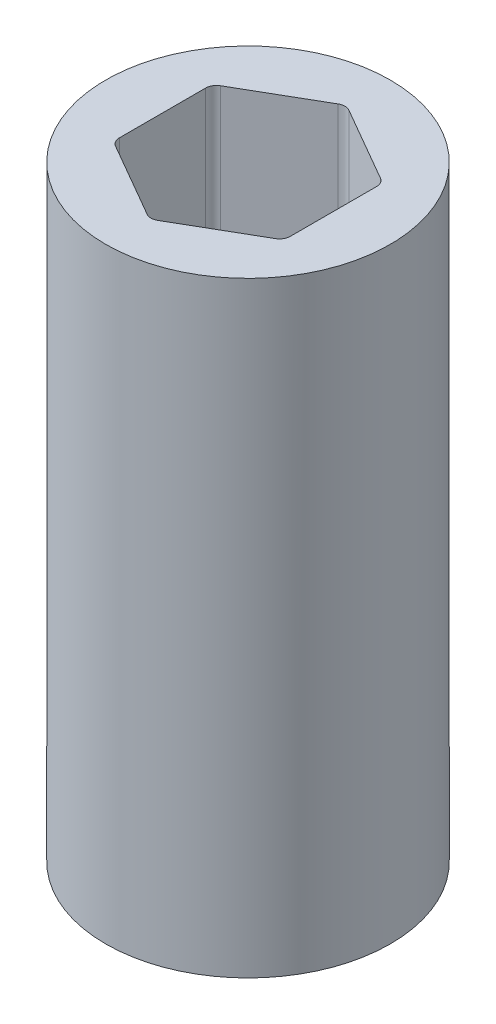
ISO-10303-21;
HEADER;
FILE_DESCRIPTION(('STEP AP214'),'2;1');
FILE_NAME('part.step','',(''),(''),'','','');
FILE_SCHEMA(('AUTOMOTIVE_DESIGN { 1 0 10303 214 1 1 1 1 }'));
ENDSEC;
DATA;
#1=APPLICATION_CONTEXT('core data for automotive mechanical design processes');
#2=APPLICATION_PROTOCOL_DEFINITION('international standard','automotive_design',2000,#1);
#3=PRODUCT_CONTEXT('',#1,'mechanical');
#4=PRODUCT('Part','Part','',(#3));
#5=PRODUCT_RELATED_PRODUCT_CATEGORY('part','',(#4));
#6=PRODUCT_DEFINITION_FORMATION('','',#4);
#7=PRODUCT_DEFINITION_CONTEXT('part definition',#1,'design');
#8=PRODUCT_DEFINITION('design','',#6,#7);
#9=PRODUCT_DEFINITION_SHAPE('','',#8);
#10=(LENGTH_UNIT() NAMED_UNIT(*) SI_UNIT(.MILLI.,.METRE.));
#11=(NAMED_UNIT(*) PLANE_ANGLE_UNIT() SI_UNIT($,.RADIAN.));
#12=(NAMED_UNIT(*) SI_UNIT($,.STERADIAN.) SOLID_ANGLE_UNIT());
#13=UNCERTAINTY_MEASURE_WITH_UNIT(LENGTH_MEASURE(1.E-05),#10,'distance_accuracy_value','');
#14=(GEOMETRIC_REPRESENTATION_CONTEXT(3) GLOBAL_UNCERTAINTY_ASSIGNED_CONTEXT((#13)) GLOBAL_UNIT_ASSIGNED_CONTEXT((#10,
#11,#12)) REPRESENTATION_CONTEXT('',''));
#15=CARTESIAN_POINT('',(0.,0.,0.));
#16=DIRECTION('',(0.,0.,1.));
#17=DIRECTION('',(1.,0.,0.));
#18=AXIS2_PLACEMENT_3D('',#15,#16,#17);
#19=CARTESIAN_POINT('',(0.,386.241430282593,0.));
#20=DIRECTION('',(0.,1.,0.));
#21=DIRECTION('',(0.,0.,-1.));
#22=AXIS2_PLACEMENT_3D('',#19,#20,#21);
#23=PLANE('',#22);
#24=DIRECTION('',(-0.866025403784439,0.,0.5));
#25=VECTOR('',#24,1.);
#26=CARTESIAN_POINT('',(0.,386.241430282593,-13.856406460551));
#27=LINE('',#26,#25);
#28=CARTESIAN_POINT('',(-0.75,386.241430282593,-13.4233937586588));
#29=VERTEX_POINT('',#28);
#30=CARTESIAN_POINT('',(-11.25,386.241430282593,-7.36121593216776));
#31=VERTEX_POINT('',#30);
#32=EDGE_CURVE('E271',#29,#31,#27,.T.);
#33=ORIENTED_EDGE('',*,*,#32,.T.);
#34=CARTESIAN_POINT('',(-10.5,386.241430282593,-6.0621778264911));
#35=DIRECTION('',(0.,1.,0.));
#36=DIRECTION('',(0.,0.,1.));
#37=AXIS2_PLACEMENT_3D('',#34,#35,#36);
#38=CIRCLE('',#37,1.5);
#39=CARTESIAN_POINT('',(-12.,386.241430282593,-6.0621778264911));
#40=VERTEX_POINT('',#39);
#41=EDGE_CURVE('E214',#31,#40,#38,.T.);
#42=ORIENTED_EDGE('',*,*,#41,.T.);
#43=DIRECTION('',(0.,0.,1.));
#44=VECTOR('',#43,1.);
#45=CARTESIAN_POINT('',(-12.,386.241430282593,-6.92820323027554));
#46=LINE('',#45,#44);
#47=CARTESIAN_POINT('',(-12.,386.241430282593,6.06217782649105));
#48=VERTEX_POINT('',#47);
#49=EDGE_CURVE('E273',#40,#48,#46,.T.);
#50=ORIENTED_EDGE('',*,*,#49,.T.);
#51=CARTESIAN_POINT('',(-10.5,386.241430282593,6.06217782649105));
#52=DIRECTION('',(0.,1.,0.));
#53=DIRECTION('',(0.,0.,1.));
#54=AXIS2_PLACEMENT_3D('',#51,#52,#53);
#55=CIRCLE('',#54,1.5);
#56=CARTESIAN_POINT('',(-11.25,386.241430282593,7.36121593216771));
#57=VERTEX_POINT('',#56);
#58=EDGE_CURVE('E212',#48,#57,#55,.T.);
#59=ORIENTED_EDGE('',*,*,#58,.T.);
#60=DIRECTION('',(0.866025403784439,0.,0.5));
#61=VECTOR('',#60,1.);
#62=CARTESIAN_POINT('',(-12.,386.241430282593,6.92820323027549));
#63=LINE('',#62,#61);
#64=CARTESIAN_POINT('',(-0.750000000000006,386.241430282593,13.4233937586588));
#65=VERTEX_POINT('',#64);
#66=EDGE_CURVE('E279',#57,#65,#63,.T.);
#67=ORIENTED_EDGE('',*,*,#66,.T.);
#68=CARTESIAN_POINT('',(0.,386.241430282593,12.1243556529821));
#69=DIRECTION('',(0.,1.,0.));
#70=DIRECTION('',(0.,0.,1.));
#71=AXIS2_PLACEMENT_3D('',#68,#69,#70);
#72=CIRCLE('',#71,1.5);
#73=CARTESIAN_POINT('',(0.749999999999996,386.241430282593,13.4233937586588));
#74=VERTEX_POINT('',#73);
#75=EDGE_CURVE('E210',#65,#74,#72,.T.);
#76=ORIENTED_EDGE('',*,*,#75,.T.);
#77=DIRECTION('',(0.866025403784439,0.,-0.5));
#78=VECTOR('',#77,1.);
#79=CARTESIAN_POINT('',(0.,386.241430282593,13.856406460551));
#80=LINE('',#79,#78);
#81=CARTESIAN_POINT('',(11.25,386.241430282593,7.36121593216771));
#82=VERTEX_POINT('',#81);
#83=EDGE_CURVE('E282',#74,#82,#80,.T.);
#84=ORIENTED_EDGE('',*,*,#83,.T.);
#85=CARTESIAN_POINT('',(10.5,386.241430282593,6.06217782649105));
#86=DIRECTION('',(0.,1.,0.));
#87=DIRECTION('',(0.,0.,1.));
#88=AXIS2_PLACEMENT_3D('',#85,#86,#87);
#89=CIRCLE('',#88,1.5);
#90=CARTESIAN_POINT('',(12.,386.241430282593,6.06217782649105));
#91=VERTEX_POINT('',#90);
#92=EDGE_CURVE('E208',#82,#91,#89,.T.);
#93=ORIENTED_EDGE('',*,*,#92,.T.);
#94=DIRECTION('',(0.,0.,-1.));
#95=VECTOR('',#94,1.);
#96=CARTESIAN_POINT('',(12.,386.241430282593,6.92820323027549));
#97=LINE('',#96,#95);
#98=CARTESIAN_POINT('',(12.,386.241430282593,5.28750097478772));
#99=VERTEX_POINT('',#98);
#100=EDGE_CURVE('E286',#91,#99,#97,.T.);
#101=ORIENTED_EDGE('',*,*,#100,.T.);
#102=DIRECTION('',(-1.,0.,0.));
#103=VECTOR('',#102,1.);
#104=CARTESIAN_POINT('',(14.8628292452561,386.241430282593,5.28750097478773));
#105=LINE('',#104,#103);
#106=CARTESIAN_POINT('',(10.6328715990376,386.241430282593,5.28750097478773));
#107=VERTEX_POINT('',#106);
#108=EDGE_CURVE('E314',#99,#107,#105,.T.);
#109=ORIENTED_EDGE('',*,*,#108,.T.);
#110=CARTESIAN_POINT('',(0.,386.241430282593,0.));
#111=DIRECTION('',(0.,-1.,0.));
#112=DIRECTION('',(0.934966219225068,0.,-0.354736760017878));
#113=AXIS2_PLACEMENT_3D('',#110,#111,#112);
#114=CIRCLE('',#113,11.875);
#115=CARTESIAN_POINT('',(11.1027238532977,386.241430282593,-4.21249902521229));
#116=VERTEX_POINT('',#115);
#117=EDGE_CURVE('E298',#107,#116,#114,.T.);
#118=ORIENTED_EDGE('',*,*,#117,.T.);
#119=DIRECTION('',(1.,0.,0.));
#120=VECTOR('',#119,1.);
#121=CARTESIAN_POINT('',(11.1027238532977,386.241430282593,-4.21249902521229));
#122=LINE('',#121,#120);
#123=CARTESIAN_POINT('',(12.,386.241430282593,-4.21249902521229));
#124=VERTEX_POINT('',#123);
#125=EDGE_CURVE('E186',#116,#124,#122,.T.);
#126=ORIENTED_EDGE('',*,*,#125,.T.);
#127=CARTESIAN_POINT('',(12.,386.241430282593,-6.0621778264911));
#128=VERTEX_POINT('',#127);
#129=EDGE_CURVE('E192',#124,#128,#97,.T.);
#130=ORIENTED_EDGE('',*,*,#129,.T.);
#131=CARTESIAN_POINT('',(10.5,386.241430282593,-6.0621778264911));
#132=DIRECTION('',(0.,1.,0.));
#133=DIRECTION('',(0.,0.,1.));
#134=AXIS2_PLACEMENT_3D('',#131,#132,#133);
#135=CIRCLE('',#134,1.5);
#136=CARTESIAN_POINT('',(11.25,386.241430282593,-7.36121593216776));
#137=VERTEX_POINT('',#136);
#138=EDGE_CURVE('E206',#128,#137,#135,.T.);
#139=ORIENTED_EDGE('',*,*,#138,.T.);
#140=DIRECTION('',(-0.866025403784439,0.,-0.5));
#141=VECTOR('',#140,1.);
#142=CARTESIAN_POINT('',(12.,386.241430282593,-6.92820323027554));
#143=LINE('',#142,#141);
#144=CARTESIAN_POINT('',(0.750000000000001,386.241430282593,-13.4233937586588));
#145=VERTEX_POINT('',#144);
#146=EDGE_CURVE('E268',#137,#145,#143,.T.);
#147=ORIENTED_EDGE('',*,*,#146,.T.);
#148=CARTESIAN_POINT('',(0.,386.241430282593,-12.1243556529822));
#149=DIRECTION('',(0.,1.,0.));
#150=DIRECTION('',(0.,0.,1.));
#151=AXIS2_PLACEMENT_3D('',#148,#149,#150);
#152=CIRCLE('',#151,1.5);
#153=EDGE_CURVE('E204',#145,#29,#152,.T.);
#154=ORIENTED_EDGE('',*,*,#153,.T.);
#155=EDGE_LOOP('',(#33,#42,#50,#59,#67,#76,#84,#93,#101,#109,#118,#126,#130,#139,#147,#154));
#156=FACE_BOUND('',#155,.T.);
#157=ADVANCED_FACE('F45',(#156),#23,.T.);
#158=CARTESIAN_POINT('',(0.,345.599983215332,0.));
#159=DIRECTION('',(0.,1.,0.));
#160=DIRECTION('',(0.,0.,-1.));
#161=AXIS2_PLACEMENT_3D('',#158,#159,#160);
#162=PLANE('',#161);
#163=DIRECTION('',(1.,0.,0.));
#164=VECTOR('',#163,1.);
#165=CARTESIAN_POINT('',(11.1027238532977,345.599983215332,-4.21249902521229));
#166=LINE('',#165,#164);
#167=CARTESIAN_POINT('',(11.1027238532977,345.599983215332,-4.21249902521229));
#168=VERTEX_POINT('',#167);
#169=CARTESIAN_POINT('',(14.8628292452561,345.599983215332,-4.21249902521229));
#170=VERTEX_POINT('',#169);
#171=EDGE_CURVE('E319',#168,#170,#166,.T.);
#172=ORIENTED_EDGE('',*,*,#171,.F.);
#173=CARTESIAN_POINT('',(0.,345.599983215332,0.));
#174=DIRECTION('',(0.,-1.,0.));
#175=DIRECTION('',(0.934966219225068,0.,-0.354736760017878));
#176=AXIS2_PLACEMENT_3D('',#173,#174,#175);
#177=CIRCLE('',#176,11.875);
#178=CARTESIAN_POINT('',(10.6328715990376,345.599983215332,5.28750097478773));
#179=VERTEX_POINT('',#178);
#180=EDGE_CURVE('E290',#179,#168,#177,.T.);
#181=ORIENTED_EDGE('',*,*,#180,.F.);
#182=DIRECTION('',(-1.,0.,0.));
#183=VECTOR('',#182,1.);
#184=CARTESIAN_POINT('',(14.8628292452561,345.599983215332,5.28750097478773));
#185=LINE('',#184,#183);
#186=CARTESIAN_POINT('',(14.8628292452561,345.599983215332,5.28750097478773));
#187=VERTEX_POINT('',#186);
#188=EDGE_CURVE('E306',#187,#179,#185,.T.);
#189=ORIENTED_EDGE('',*,*,#188,.F.);
#190=DIRECTION('',(0.,0.,1.));
#191=VECTOR('',#190,1.);
#192=CARTESIAN_POINT('',(14.8628292452561,345.599983215332,-4.21249902521229));
#193=LINE('',#192,#191);
#194=EDGE_CURVE('E307',#170,#187,#193,.T.);
#195=ORIENTED_EDGE('',*,*,#194,.F.);
#196=EDGE_LOOP('',(#172,#181,#189,#195));
#197=FACE_BOUND('',#196,.T.);
#198=CARTESIAN_POINT('',(0.,345.599983215332,0.));
#199=DIRECTION('',(0.,1.,0.));
#200=DIRECTION('',(-1.,0.,0.));
#201=AXIS2_PLACEMENT_3D('',#198,#199,#200);
#202=CIRCLE('',#201,20.);
#203=CARTESIAN_POINT('',(20.,345.599983215332,0.));
#204=VERTEX_POINT('',#203);
#205=EDGE_CURVE('E184',#204,#204,#202,.T.);
#206=ORIENTED_EDGE('',*,*,#205,.F.);
#207=EDGE_LOOP('',(#206));
#208=FACE_BOUND('',#207,.T.);
#209=ADVANCED_FACE('F408',(#197,#208),#162,.F.);
#210=CARTESIAN_POINT('',(0.,355.09996632461,0.));
#211=DIRECTION('',(0.,1.,0.));
#212=DIRECTION('',(-1.,0.,0.));
#213=AXIS2_PLACEMENT_3D('',#210,#211,#212);
#214=CYLINDRICAL_SURFACE('',#213,20.);
#215=DIRECTION('',(0.,-1.,0.));
#216=VECTOR('',#215,1.);
#217=CARTESIAN_POINT('',(20.,355.09996632461,0.));
#218=LINE('',#217,#216);
#219=CARTESIAN_POINT('',(20.,386.241430282593,0.));
#220=VERTEX_POINT('',#219);
#221=EDGE_CURVE('E180',#220,#204,#218,.T.);
#222=ORIENTED_EDGE('',*,*,#221,.F.);
#223=ORIENTED_EDGE('',*,*,#221,.T.);
#224=ORIENTED_EDGE('',*,*,#205,.T.);
#225=EDGE_LOOP('',(#222,#223,#224));
#226=FACE_BOUND('',#225,.T.);
#227=CARTESIAN_POINT('',(0.,430.741430282593,0.));
#228=DIRECTION('',(0.,1.,0.));
#229=DIRECTION('',(0.,0.,1.));
#230=AXIS2_PLACEMENT_3D('',#227,#228,#229);
#231=CIRCLE('',#230,20.);
#232=CARTESIAN_POINT('',(0.,430.741430282593,20.));
#233=VERTEX_POINT('',#232);
#234=EDGE_CURVE('E261',#233,#233,#231,.T.);
#235=ORIENTED_EDGE('',*,*,#234,.F.);
#236=EDGE_LOOP('',(#235));
#237=FACE_BOUND('',#236,.T.);
#238=ADVANCED_FACE('F181',(#226,#237),#214,.T.);
#239=CARTESIAN_POINT('',(11.1027238532977,355.09996632461,-4.21249902521229));
#240=DIRECTION('',(0.,0.,1.));
#241=DIRECTION('',(1.,0.,0.));
#242=AXIS2_PLACEMENT_3D('',#239,#240,#241);
#243=PLANE('',#242);
#244=ORIENTED_EDGE('',*,*,#171,.T.);
#245=DIRECTION('',(0.,1.,0.));
#246=VECTOR('',#245,1.);
#247=CARTESIAN_POINT('',(14.8628292452561,355.09996632461,-4.21249902521229));
#248=LINE('',#247,#246);
#249=CARTESIAN_POINT('',(14.8628292452561,386.241430282593,-4.21249902521229));
#250=VERTEX_POINT('',#249);
#251=EDGE_CURVE('E315',#170,#250,#248,.T.);
#252=ORIENTED_EDGE('',*,*,#251,.T.);
#253=EDGE_CURVE('E195',#124,#250,#122,.T.);
#254=ORIENTED_EDGE('',*,*,#253,.F.);
#255=ORIENTED_EDGE('',*,*,#125,.F.);
#256=DIRECTION('',(0.,1.,0.));
#257=VECTOR('',#256,1.);
#258=CARTESIAN_POINT('',(11.1027238532977,355.09996632461,-4.21249902521229));
#259=LINE('',#258,#257);
#260=EDGE_CURVE('E293',#168,#116,#259,.T.);
#261=ORIENTED_EDGE('',*,*,#260,.F.);
#262=EDGE_LOOP('',(#244,#252,#254,#255,#261));
#263=FACE_BOUND('',#262,.T.);
#264=ADVANCED_FACE('F343',(#263),#243,.T.);
#265=CARTESIAN_POINT('',(14.8628292452561,355.09996632461,-4.21249902521229));
#266=DIRECTION('',(-1.,0.,0.));
#267=DIRECTION('',(0.,1.,0.));
#268=AXIS2_PLACEMENT_3D('',#265,#266,#267);
#269=PLANE('',#268);
#270=ORIENTED_EDGE('',*,*,#194,.T.);
#271=DIRECTION('',(0.,1.,0.));
#272=VECTOR('',#271,1.);
#273=CARTESIAN_POINT('',(14.8628292452561,355.09996632461,5.28750097478773));
#274=LINE('',#273,#272);
#275=CARTESIAN_POINT('',(14.8628292452561,386.241430282593,5.28750097478772));
#276=VERTEX_POINT('',#275);
#277=EDGE_CURVE('E311',#187,#276,#274,.T.);
#278=ORIENTED_EDGE('',*,*,#277,.T.);
#279=DIRECTION('',(0.,0.,1.));
#280=VECTOR('',#279,1.);
#281=CARTESIAN_POINT('',(14.8628292452561,386.241430282593,-4.21249902521229));
#282=LINE('',#281,#280);
#283=EDGE_CURVE('E310',#250,#276,#282,.T.);
#284=ORIENTED_EDGE('',*,*,#283,.F.);
#285=ORIENTED_EDGE('',*,*,#251,.F.);
#286=EDGE_LOOP('',(#270,#278,#284,#285));
#287=FACE_BOUND('',#286,.T.);
#288=ADVANCED_FACE('F346',(#287),#269,.T.);
#289=CARTESIAN_POINT('',(14.8628292452561,355.09996632461,5.28750097478773));
#290=DIRECTION('',(0.,0.,-1.));
#291=DIRECTION('',(-1.,0.,0.));
#292=AXIS2_PLACEMENT_3D('',#289,#290,#291);
#293=PLANE('',#292);
#294=ORIENTED_EDGE('',*,*,#188,.T.);
#295=DIRECTION('',(0.,1.,0.));
#296=VECTOR('',#295,1.);
#297=CARTESIAN_POINT('',(10.6328715990376,355.09996632461,5.28750097478773));
#298=LINE('',#297,#296);
#299=EDGE_CURVE('E302',#179,#107,#298,.T.);
#300=ORIENTED_EDGE('',*,*,#299,.T.);
#301=ORIENTED_EDGE('',*,*,#108,.F.);
#302=EDGE_CURVE('E325',#276,#99,#105,.T.);
#303=ORIENTED_EDGE('',*,*,#302,.F.);
#304=ORIENTED_EDGE('',*,*,#277,.F.);
#305=EDGE_LOOP('',(#294,#300,#301,#303,#304));
#306=FACE_BOUND('',#305,.T.);
#307=ADVANCED_FACE('F352',(#306),#293,.T.);
#308=CARTESIAN_POINT('',(0.,355.09996632461,0.));
#309=DIRECTION('',(0.,1.,0.));
#310=DIRECTION('',(-0.99877918581363,0.,-0.0493977528381742));
#311=AXIS2_PLACEMENT_3D('',#308,#309,#310);
#312=CYLINDRICAL_SURFACE('',#311,11.875);
#313=ORIENTED_EDGE('',*,*,#180,.T.);
#314=ORIENTED_EDGE('',*,*,#260,.T.);
#315=ORIENTED_EDGE('',*,*,#117,.F.);
#316=ORIENTED_EDGE('',*,*,#299,.F.);
#317=EDGE_LOOP('',(#313,#314,#315,#316));
#318=FACE_BOUND('',#317,.T.);
#319=ADVANCED_FACE('F441',(#318),#312,.F.);
#320=CARTESIAN_POINT('',(0.,386.241430282593,0.));
#321=DIRECTION('',(0.,1.,0.));
#322=DIRECTION('',(0.,0.,1.));
#323=AXIS2_PLACEMENT_3D('',#320,#321,#322);
#324=PLANE('',#323);
#325=EDGE_CURVE('E285',#99,#124,#97,.T.);
#326=ORIENTED_EDGE('',*,*,#325,.T.);
#327=ORIENTED_EDGE('',*,*,#253,.T.);
#328=ORIENTED_EDGE('',*,*,#283,.T.);
#329=ORIENTED_EDGE('',*,*,#302,.T.);
#330=EDGE_LOOP('',(#326,#327,#328,#329));
#331=FACE_BOUND('',#330,.T.);
#332=ADVANCED_FACE('F340',(#331),#324,.F.);
#333=CARTESIAN_POINT('',(0.,430.741430282593,0.));
#334=DIRECTION('',(0.,1.,0.));
#335=DIRECTION('',(0.,0.,1.));
#336=AXIS2_PLACEMENT_3D('',#333,#334,#335);
#337=PLANE('',#336);
#338=ORIENTED_EDGE('',*,*,#234,.T.);
#339=EDGE_LOOP('',(#338));
#340=FACE_BOUND('',#339,.T.);
#341=DIRECTION('',(-0.866025403784439,0.,0.5));
#342=VECTOR('',#341,1.);
#343=CARTESIAN_POINT('',(0.,430.741430282593,-13.8564064605511));
#344=LINE('',#343,#342);
#345=CARTESIAN_POINT('',(-0.75,430.741430282593,-13.4233937586588));
#346=VERTEX_POINT('',#345);
#347=CARTESIAN_POINT('',(-11.25,430.741430282593,-7.36121593216776));
#348=VERTEX_POINT('',#347);
#349=EDGE_CURVE('E370',#346,#348,#344,.T.);
#350=ORIENTED_EDGE('',*,*,#349,.F.);
#351=CARTESIAN_POINT('',(0.,430.741430282593,-12.1243556529822));
#352=DIRECTION('',(0.,1.,0.));
#353=DIRECTION('',(0.,0.,1.));
#354=AXIS2_PLACEMENT_3D('',#351,#352,#353);
#355=CIRCLE('',#354,1.5);
#356=CARTESIAN_POINT('',(0.750000000000002,430.741430282593,-13.4233937586588));
#357=VERTEX_POINT('',#356);
#358=EDGE_CURVE('E11',#346,#357,#355,.F.);
#359=ORIENTED_EDGE('',*,*,#358,.T.);
#360=DIRECTION('',(-0.866025403784439,0.,-0.5));
#361=VECTOR('',#360,1.);
#362=CARTESIAN_POINT('',(12.,430.741430282593,-6.92820323027554));
#363=LINE('',#362,#361);
#364=CARTESIAN_POINT('',(11.25,430.741430282593,-7.36121593216776));
#365=VERTEX_POINT('',#364);
#366=EDGE_CURVE('E253',#365,#357,#363,.T.);
#367=ORIENTED_EDGE('',*,*,#366,.F.);
#368=CARTESIAN_POINT('',(10.5,430.741430282593,-6.06217782649111));
#369=DIRECTION('',(0.,1.,0.));
#370=DIRECTION('',(0.,0.,1.));
#371=AXIS2_PLACEMENT_3D('',#368,#369,#370);
#372=CIRCLE('',#371,1.5);
#373=CARTESIAN_POINT('',(12.,430.741430282593,-6.06217782649111));
#374=VERTEX_POINT('',#373);
#375=EDGE_CURVE('E53',#365,#374,#372,.F.);
#376=ORIENTED_EDGE('',*,*,#375,.T.);
#377=DIRECTION('',(0.,0.,-1.));
#378=VECTOR('',#377,1.);
#379=CARTESIAN_POINT('',(12.,430.741430282593,6.92820323027549));
#380=LINE('',#379,#378);
#381=CARTESIAN_POINT('',(12.,430.741430282593,6.06217782649105));
#382=VERTEX_POINT('',#381);
#383=EDGE_CURVE('E251',#382,#374,#380,.T.);
#384=ORIENTED_EDGE('',*,*,#383,.F.);
#385=CARTESIAN_POINT('',(10.5,430.741430282593,6.06217782649105));
#386=DIRECTION('',(0.,1.,0.));
#387=DIRECTION('',(0.,0.,1.));
#388=AXIS2_PLACEMENT_3D('',#385,#386,#387);
#389=CIRCLE('',#388,1.5);
#390=CARTESIAN_POINT('',(11.25,430.741430282593,7.36121593216771));
#391=VERTEX_POINT('',#390);
#392=EDGE_CURVE('E246',#382,#391,#389,.F.);
#393=ORIENTED_EDGE('',*,*,#392,.T.);
#394=DIRECTION('',(0.866025403784439,0.,-0.5));
#395=VECTOR('',#394,1.);
#396=CARTESIAN_POINT('',(0.,430.741430282593,13.856406460551));
#397=LINE('',#396,#395);
#398=CARTESIAN_POINT('',(0.749999999999996,430.741430282593,13.4233937586588));
#399=VERTEX_POINT('',#398);
#400=EDGE_CURVE('E262',#399,#391,#397,.T.);
#401=ORIENTED_EDGE('',*,*,#400,.F.);
#402=CARTESIAN_POINT('',(0.,430.741430282593,12.1243556529821));
#403=DIRECTION('',(0.,1.,0.));
#404=DIRECTION('',(0.,0.,1.));
#405=AXIS2_PLACEMENT_3D('',#402,#403,#404);
#406=CIRCLE('',#405,1.5);
#407=CARTESIAN_POINT('',(-0.750000000000006,430.741430282593,13.4233937586588));
#408=VERTEX_POINT('',#407);
#409=EDGE_CURVE('E244',#399,#408,#406,.F.);
#410=ORIENTED_EDGE('',*,*,#409,.T.);
#411=DIRECTION('',(0.866025403784439,0.,0.5));
#412=VECTOR('',#411,1.);
#413=CARTESIAN_POINT('',(-12.,430.741430282593,6.92820323027548));
#414=LINE('',#413,#412);
#415=CARTESIAN_POINT('',(-11.25,430.741430282593,7.3612159321677));
#416=VERTEX_POINT('',#415);
#417=EDGE_CURVE('E363',#416,#408,#414,.T.);
#418=ORIENTED_EDGE('',*,*,#417,.F.);
#419=CARTESIAN_POINT('',(-10.5,430.741430282593,6.06217782649104));
#420=DIRECTION('',(0.,1.,0.));
#421=DIRECTION('',(0.,0.,1.));
#422=AXIS2_PLACEMENT_3D('',#419,#420,#421);
#423=CIRCLE('',#422,1.5);
#424=CARTESIAN_POINT('',(-12.,430.741430282593,6.06217782649104));
#425=VERTEX_POINT('',#424);
#426=EDGE_CURVE('E242',#416,#425,#423,.F.);
#427=ORIENTED_EDGE('',*,*,#426,.T.);
#428=DIRECTION('',(0.,0.,1.));
#429=VECTOR('',#428,1.);
#430=CARTESIAN_POINT('',(-12.,430.741430282593,-6.92820323027554));
#431=LINE('',#430,#429);
#432=CARTESIAN_POINT('',(-12.,430.741430282593,-6.0621778264911));
#433=VERTEX_POINT('',#432);
#434=EDGE_CURVE('E365',#433,#425,#431,.T.);
#435=ORIENTED_EDGE('',*,*,#434,.F.);
#436=CARTESIAN_POINT('',(-10.5,430.741430282593,-6.0621778264911));
#437=DIRECTION('',(0.,1.,0.));
#438=DIRECTION('',(0.,0.,1.));
#439=AXIS2_PLACEMENT_3D('',#436,#437,#438);
#440=CIRCLE('',#439,1.5);
#441=EDGE_CURVE('E240',#433,#348,#440,.F.);
#442=ORIENTED_EDGE('',*,*,#441,.T.);
#443=EDGE_LOOP('',(#350,#359,#367,#376,#384,#393,#401,#410,#418,#427,#435,#442));
#444=FACE_BOUND('',#443,.T.);
#445=ADVANCED_FACE('F250',(#340,#444),#337,.T.);
#446=CARTESIAN_POINT('',(12.,430.741430282593,-6.92820323027554));
#447=DIRECTION('',(-0.5,0.,0.866025403784439));
#448=DIRECTION('',(0.866025403784439,0.,0.5));
#449=AXIS2_PLACEMENT_3D('',#446,#447,#448);
#450=PLANE('',#449);
#451=ORIENTED_EDGE('',*,*,#146,.F.);
#452=DIRECTION('',(0.,-1.,0.));
#453=VECTOR('',#452,1.);
#454=CARTESIAN_POINT('',(11.25,430.741430282593,-7.36121593216776));
#455=LINE('',#454,#453);
#456=EDGE_CURVE('E65',#137,#365,#455,.F.);
#457=ORIENTED_EDGE('',*,*,#456,.T.);
#458=ORIENTED_EDGE('',*,*,#366,.T.);
#459=DIRECTION('',(0.,-1.,0.));
#460=VECTOR('',#459,1.);
#461=CARTESIAN_POINT('',(0.75,386.241430282593,-13.4233937586588));
#462=LINE('',#461,#460);
#463=EDGE_CURVE('E236',#357,#145,#462,.T.);
#464=ORIENTED_EDGE('',*,*,#463,.T.);
#465=EDGE_LOOP('',(#451,#457,#458,#464));
#466=FACE_BOUND('',#465,.T.);
#467=ADVANCED_FACE('F269',(#466),#450,.T.);
#468=CARTESIAN_POINT('',(0.,430.741430282593,-13.8564064605511));
#469=DIRECTION('',(0.5,0.,0.866025403784439));
#470=DIRECTION('',(0.866025403784439,0.,-0.5));
#471=AXIS2_PLACEMENT_3D('',#468,#469,#470);
#472=PLANE('',#471);
#473=ORIENTED_EDGE('',*,*,#349,.T.);
#474=DIRECTION('',(0.,-1.,0.));
#475=VECTOR('',#474,1.);
#476=CARTESIAN_POINT('',(-11.25,386.241430282593,-7.36121593216776));
#477=LINE('',#476,#475);
#478=EDGE_CURVE('E201',#348,#31,#477,.T.);
#479=ORIENTED_EDGE('',*,*,#478,.T.);
#480=ORIENTED_EDGE('',*,*,#32,.F.);
#481=DIRECTION('',(0.,-1.,0.));
#482=VECTOR('',#481,1.);
#483=CARTESIAN_POINT('',(-0.75,430.741430282593,-13.4233937586588));
#484=LINE('',#483,#482);
#485=EDGE_CURVE('E199',#29,#346,#484,.F.);
#486=ORIENTED_EDGE('',*,*,#485,.T.);
#487=EDGE_LOOP('',(#473,#479,#480,#486));
#488=FACE_BOUND('',#487,.T.);
#489=ADVANCED_FACE('F377',(#488),#472,.T.);
#490=CARTESIAN_POINT('',(-12.,430.741430282593,-6.92820323027554));
#491=DIRECTION('',(1.,0.,0.));
#492=DIRECTION('',(0.,0.,-1.));
#493=AXIS2_PLACEMENT_3D('',#490,#491,#492);
#494=PLANE('',#493);
#495=ORIENTED_EDGE('',*,*,#49,.F.);
#496=DIRECTION('',(0.,-1.,0.));
#497=VECTOR('',#496,1.);
#498=CARTESIAN_POINT('',(-12.,430.741430282593,-6.0621778264911));
#499=LINE('',#498,#497);
#500=EDGE_CURVE('E219',#40,#433,#499,.F.);
#501=ORIENTED_EDGE('',*,*,#500,.T.);
#502=ORIENTED_EDGE('',*,*,#434,.T.);
#503=DIRECTION('',(0.,-1.,0.));
#504=VECTOR('',#503,1.);
#505=CARTESIAN_POINT('',(-12.,386.241430282593,6.06217782649105));
#506=LINE('',#505,#504);
#507=EDGE_CURVE('E216',#425,#48,#506,.T.);
#508=ORIENTED_EDGE('',*,*,#507,.T.);
#509=EDGE_LOOP('',(#495,#501,#502,#508));
#510=FACE_BOUND('',#509,.T.);
#511=ADVANCED_FACE('F385',(#510),#494,.T.);
#512=CARTESIAN_POINT('',(-12.,430.741430282593,6.92820323027548));
#513=DIRECTION('',(0.5,0.,-0.866025403784438));
#514=DIRECTION('',(-0.866025403784439,0.,-0.5));
#515=AXIS2_PLACEMENT_3D('',#512,#513,#514);
#516=PLANE('',#515);
#517=ORIENTED_EDGE('',*,*,#66,.F.);
#518=DIRECTION('',(0.,-1.,0.));
#519=VECTOR('',#518,1.);
#520=CARTESIAN_POINT('',(-11.25,430.741430282593,7.3612159321677));
#521=LINE('',#520,#519);
#522=EDGE_CURVE('E224',#57,#416,#521,.F.);
#523=ORIENTED_EDGE('',*,*,#522,.T.);
#524=ORIENTED_EDGE('',*,*,#417,.T.);
#525=DIRECTION('',(0.,-1.,0.));
#526=VECTOR('',#525,1.);
#527=CARTESIAN_POINT('',(-0.750000000000005,386.241430282593,13.4233937586588));
#528=LINE('',#527,#526);
#529=EDGE_CURVE('E221',#408,#65,#528,.T.);
#530=ORIENTED_EDGE('',*,*,#529,.T.);
#531=EDGE_LOOP('',(#517,#523,#524,#530));
#532=FACE_BOUND('',#531,.T.);
#533=ADVANCED_FACE('F394',(#532),#516,.T.);
#534=CARTESIAN_POINT('',(0.,430.741430282593,13.856406460551));
#535=DIRECTION('',(-0.5,0.,-0.866025403784439));
#536=DIRECTION('',(-0.866025403784439,0.,0.5));
#537=AXIS2_PLACEMENT_3D('',#534,#535,#536);
#538=PLANE('',#537);
#539=ORIENTED_EDGE('',*,*,#83,.F.);
#540=DIRECTION('',(0.,-1.,0.));
#541=VECTOR('',#540,1.);
#542=CARTESIAN_POINT('',(0.749999999999996,430.741430282593,13.4233937586588));
#543=LINE('',#542,#541);
#544=EDGE_CURVE('E229',#74,#399,#543,.F.);
#545=ORIENTED_EDGE('',*,*,#544,.T.);
#546=ORIENTED_EDGE('',*,*,#400,.T.);
#547=DIRECTION('',(0.,-1.,0.));
#548=VECTOR('',#547,1.);
#549=CARTESIAN_POINT('',(11.25,386.241430282593,7.36121593216771));
#550=LINE('',#549,#548);
#551=EDGE_CURVE('E226',#391,#82,#550,.T.);
#552=ORIENTED_EDGE('',*,*,#551,.T.);
#553=EDGE_LOOP('',(#539,#545,#546,#552));
#554=FACE_BOUND('',#553,.T.);
#555=ADVANCED_FACE('F361',(#554),#538,.T.);
#556=CARTESIAN_POINT('',(12.,430.741430282593,6.92820323027549));
#557=DIRECTION('',(-1.,0.,0.));
#558=DIRECTION('',(0.,-1.,0.));
#559=AXIS2_PLACEMENT_3D('',#556,#557,#558);
#560=PLANE('',#559);
#561=ORIENTED_EDGE('',*,*,#100,.F.);
#562=DIRECTION('',(0.,-1.,0.));
#563=VECTOR('',#562,1.);
#564=CARTESIAN_POINT('',(12.,430.741430282593,6.06217782649105));
#565=LINE('',#564,#563);
#566=EDGE_CURVE('E234',#91,#382,#565,.F.);
#567=ORIENTED_EDGE('',*,*,#566,.T.);
#568=ORIENTED_EDGE('',*,*,#383,.T.);
#569=DIRECTION('',(0.,-1.,0.));
#570=VECTOR('',#569,1.);
#571=CARTESIAN_POINT('',(12.,386.241430282593,-6.0621778264911));
#572=LINE('',#571,#570);
#573=EDGE_CURVE('E231',#374,#128,#572,.T.);
#574=ORIENTED_EDGE('',*,*,#573,.T.);
#575=ORIENTED_EDGE('',*,*,#129,.F.);
#576=ORIENTED_EDGE('',*,*,#325,.F.);
#577=EDGE_LOOP('',(#561,#567,#568,#574,#575,#576));
#578=FACE_BOUND('',#577,.T.);
#579=ADVANCED_FACE('F258',(#578),#560,.T.);
#580=CARTESIAN_POINT('',(-10.5,430.741430282593,-6.0621778264911));
#581=DIRECTION('',(0.,1.,0.));
#582=DIRECTION('',(0.,0.,1.));
#583=AXIS2_PLACEMENT_3D('',#580,#581,#582);
#584=CYLINDRICAL_SURFACE('',#583,1.5);
#585=ORIENTED_EDGE('',*,*,#441,.F.);
#586=ORIENTED_EDGE('',*,*,#500,.F.);
#587=ORIENTED_EDGE('',*,*,#41,.F.);
#588=ORIENTED_EDGE('',*,*,#478,.F.);
#589=EDGE_LOOP('',(#585,#586,#587,#588));
#590=FACE_BOUND('',#589,.T.);
#591=ADVANCED_FACE('F381',(#590),#584,.F.);
#592=CARTESIAN_POINT('',(-10.5,430.741430282593,6.06217782649104));
#593=DIRECTION('',(0.,1.,0.));
#594=DIRECTION('',(0.,0.,1.));
#595=AXIS2_PLACEMENT_3D('',#592,#593,#594);
#596=CYLINDRICAL_SURFACE('',#595,1.5);
#597=ORIENTED_EDGE('',*,*,#426,.F.);
#598=ORIENTED_EDGE('',*,*,#522,.F.);
#599=ORIENTED_EDGE('',*,*,#58,.F.);
#600=ORIENTED_EDGE('',*,*,#507,.F.);
#601=EDGE_LOOP('',(#597,#598,#599,#600));
#602=FACE_BOUND('',#601,.T.);
#603=ADVANCED_FACE('F390',(#602),#596,.F.);
#604=CARTESIAN_POINT('',(0.,430.741430282593,12.1243556529821));
#605=DIRECTION('',(0.,1.,0.));
#606=DIRECTION('',(0.,0.,1.));
#607=AXIS2_PLACEMENT_3D('',#604,#605,#606);
#608=CYLINDRICAL_SURFACE('',#607,1.5);
#609=ORIENTED_EDGE('',*,*,#409,.F.);
#610=ORIENTED_EDGE('',*,*,#544,.F.);
#611=ORIENTED_EDGE('',*,*,#75,.F.);
#612=ORIENTED_EDGE('',*,*,#529,.F.);
#613=EDGE_LOOP('',(#609,#610,#611,#612));
#614=FACE_BOUND('',#613,.T.);
#615=ADVANCED_FACE('F398',(#614),#608,.F.);
#616=CARTESIAN_POINT('',(10.5,430.741430282593,6.06217782649105));
#617=DIRECTION('',(0.,1.,0.));
#618=DIRECTION('',(0.,0.,1.));
#619=AXIS2_PLACEMENT_3D('',#616,#617,#618);
#620=CYLINDRICAL_SURFACE('',#619,1.5);
#621=ORIENTED_EDGE('',*,*,#392,.F.);
#622=ORIENTED_EDGE('',*,*,#566,.F.);
#623=ORIENTED_EDGE('',*,*,#92,.F.);
#624=ORIENTED_EDGE('',*,*,#551,.F.);
#625=EDGE_LOOP('',(#621,#622,#623,#624));
#626=FACE_BOUND('',#625,.T.);
#627=ADVANCED_FACE('F354',(#626),#620,.F.);
#628=CARTESIAN_POINT('',(10.5,430.741430282593,-6.06217782649111));
#629=DIRECTION('',(0.,1.,0.));
#630=DIRECTION('',(0.,0.,1.));
#631=AXIS2_PLACEMENT_3D('',#628,#629,#630);
#632=CYLINDRICAL_SURFACE('',#631,1.5);
#633=ORIENTED_EDGE('',*,*,#375,.F.);
#634=ORIENTED_EDGE('',*,*,#456,.F.);
#635=ORIENTED_EDGE('',*,*,#138,.F.);
#636=ORIENTED_EDGE('',*,*,#573,.F.);
#637=EDGE_LOOP('',(#633,#634,#635,#636));
#638=FACE_BOUND('',#637,.T.);
#639=ADVANCED_FACE('F264',(#638),#632,.F.);
#640=CARTESIAN_POINT('',(0.,430.741430282593,-12.1243556529822));
#641=DIRECTION('',(0.,1.,0.));
#642=DIRECTION('',(0.,0.,1.));
#643=AXIS2_PLACEMENT_3D('',#640,#641,#642);
#644=CYLINDRICAL_SURFACE('',#643,1.5);
#645=ORIENTED_EDGE('',*,*,#358,.F.);
#646=ORIENTED_EDGE('',*,*,#485,.F.);
#647=ORIENTED_EDGE('',*,*,#153,.F.);
#648=ORIENTED_EDGE('',*,*,#463,.F.);
#649=EDGE_LOOP('',(#645,#646,#647,#648));
#650=FACE_BOUND('',#649,.T.);
#651=ADVANCED_FACE('F47',(#650),#644,.F.);
#652=CLOSED_SHELL('',(#157,#209,#238,#264,#288,#307,#319,#332,#445,#467,#489,#511,#533,#555,
#579,#591,#603,#615,#627,#639,#651));
#653=MANIFOLD_SOLID_BREP('B2',#652);
#654=ADVANCED_BREP_SHAPE_REPRESENTATION('',(#18,#653),#14);
#655=SHAPE_DEFINITION_REPRESENTATION(#9,#654);
ENDSEC;
END-ISO-10303-21;
